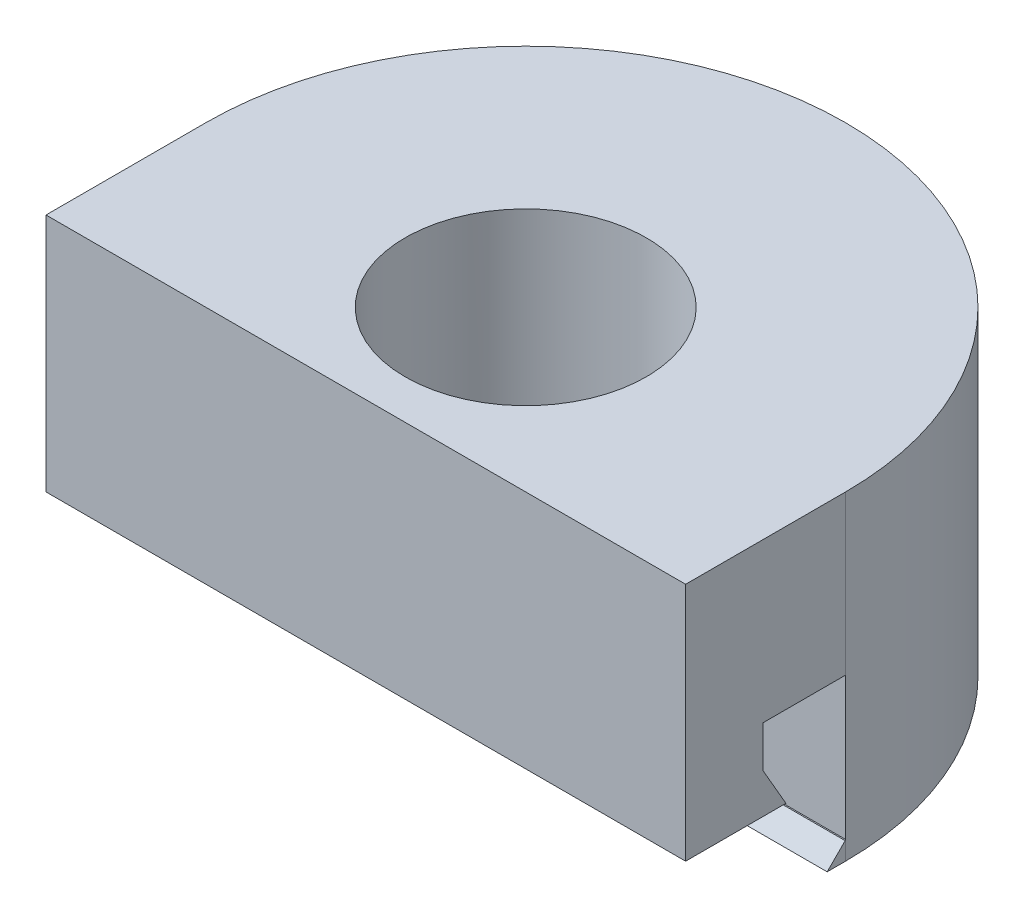
ISO-10303-21;
HEADER;
FILE_DESCRIPTION(('STEP AP214'),'2;1');
FILE_NAME('part.step','',(''),(''),'','','');
FILE_SCHEMA(('AUTOMOTIVE_DESIGN { 1 0 10303 214 1 1 1 1 }'));
ENDSEC;
DATA;
#1=APPLICATION_CONTEXT('core data for automotive mechanical design processes');
#2=APPLICATION_PROTOCOL_DEFINITION('international standard','automotive_design',2000,#1);
#3=PRODUCT_CONTEXT('',#1,'mechanical');
#4=PRODUCT('Part','Part','',(#3));
#5=PRODUCT_RELATED_PRODUCT_CATEGORY('part','',(#4));
#6=PRODUCT_DEFINITION_FORMATION('','',#4);
#7=PRODUCT_DEFINITION_CONTEXT('part definition',#1,'design');
#8=PRODUCT_DEFINITION('design','',#6,#7);
#9=PRODUCT_DEFINITION_SHAPE('','',#8);
#10=(LENGTH_UNIT() NAMED_UNIT(*) SI_UNIT(.MILLI.,.METRE.));
#11=(NAMED_UNIT(*) PLANE_ANGLE_UNIT() SI_UNIT($,.RADIAN.));
#12=(NAMED_UNIT(*) SI_UNIT($,.STERADIAN.) SOLID_ANGLE_UNIT());
#13=UNCERTAINTY_MEASURE_WITH_UNIT(LENGTH_MEASURE(1.E-05),#10,'distance_accuracy_value','');
#14=(GEOMETRIC_REPRESENTATION_CONTEXT(3) GLOBAL_UNCERTAINTY_ASSIGNED_CONTEXT((#13)) GLOBAL_UNIT_ASSIGNED_CONTEXT((#10,
#11,#12)) REPRESENTATION_CONTEXT('',''));
#15=CARTESIAN_POINT('',(0.,0.,0.));
#16=DIRECTION('',(0.,0.,1.));
#17=DIRECTION('',(1.,0.,0.));
#18=AXIS2_PLACEMENT_3D('',#15,#16,#17);
#19=CARTESIAN_POINT('',(0.,0.,0.));
#20=DIRECTION('',(0.,1.,0.));
#21=DIRECTION('',(0.,0.,1.));
#22=AXIS2_PLACEMENT_3D('',#19,#20,#21);
#23=PLANE('',#22);
#24=DIRECTION('',(1.,0.,0.));
#25=VECTOR('',#24,1.);
#26=CARTESIAN_POINT('',(0.,0.,2.9171512875255));
#27=LINE('',#26,#25);
#28=CARTESIAN_POINT('',(-50.8,0.,2.91715128752548));
#29=VERTEX_POINT('',#28);
#30=CARTESIAN_POINT('',(-18.9265086699552,0.,2.91715128752549));
#31=VERTEX_POINT('',#30);
#32=EDGE_CURVE('E239',#29,#31,#27,.T.);
#33=ORIENTED_EDGE('',*,*,#32,.F.);
#34=DIRECTION('',(0.,0.,-1.));
#35=VECTOR('',#34,1.);
#36=CARTESIAN_POINT('',(-50.8,0.,25.4));
#37=LINE('',#36,#35);
#38=CARTESIAN_POINT('',(-50.8,0.,0.));
#39=VERTEX_POINT('',#38);
#40=EDGE_CURVE('E51',#29,#39,#37,.T.);
#41=ORIENTED_EDGE('',*,*,#40,.T.);
#42=CARTESIAN_POINT('',(0.,0.,0.));
#43=DIRECTION('',(0.,1.,0.));
#44=DIRECTION('',(0.,0.,1.));
#45=AXIS2_PLACEMENT_3D('',#42,#43,#44);
#46=CIRCLE('',#45,50.8);
#47=CARTESIAN_POINT('',(50.8,0.,0.));
#48=VERTEX_POINT('',#47);
#49=EDGE_CURVE('E279',#48,#39,#46,.T.);
#50=ORIENTED_EDGE('',*,*,#49,.F.);
#51=DIRECTION('',(0.,0.,-1.));
#52=VECTOR('',#51,1.);
#53=CARTESIAN_POINT('',(50.8,0.,25.4));
#54=LINE('',#53,#52);
#55=CARTESIAN_POINT('',(50.8,0.,2.91715128752547));
#56=VERTEX_POINT('',#55);
#57=EDGE_CURVE('E60',#56,#48,#54,.T.);
#58=ORIENTED_EDGE('',*,*,#57,.F.);
#59=CARTESIAN_POINT('',(18.9265086699552,0.,2.9171512875255));
#60=VERTEX_POINT('',#59);
#61=EDGE_CURVE('E241',#60,#56,#27,.T.);
#62=ORIENTED_EDGE('',*,*,#61,.F.);
#63=CARTESIAN_POINT('',(0.,0.,0.));
#64=DIRECTION('',(0.,1.,0.));
#65=DIRECTION('',(0.,0.,1.));
#66=AXIS2_PLACEMENT_3D('',#63,#64,#65);
#67=CIRCLE('',#66,19.150000054);
#68=EDGE_CURVE('E254',#60,#31,#67,.T.);
#69=ORIENTED_EDGE('',*,*,#68,.T.);
#70=EDGE_LOOP('',(#33,#41,#50,#58,#62,#69));
#71=FACE_BOUND('',#70,.T.);
#72=ADVANCED_FACE('F35',(#71),#23,.F.);
#73=CARTESIAN_POINT('',(-50.8,50.8,25.4));
#74=DIRECTION('',(1.,0.,0.));
#75=DIRECTION('',(0.,0.,-1.));
#76=AXIS2_PLACEMENT_3D('',#73,#74,#75);
#77=PLANE('',#76);
#78=DIRECTION('',(0.,1.,0.));
#79=VECTOR('',#78,1.);
#80=CARTESIAN_POINT('',(-50.8,25.6,13.1000000000001));
#81=LINE('',#80,#79);
#82=CARTESIAN_POINT('',(-50.8,19.05,13.1000000000001));
#83=VERTEX_POINT('',#82);
#84=CARTESIAN_POINT('',(-50.8,25.6,13.1000000000001));
#85=VERTEX_POINT('',#84);
#86=EDGE_CURVE('E182',#83,#85,#81,.T.);
#87=ORIENTED_EDGE('',*,*,#86,.F.);
#88=CARTESIAN_POINT('',(-50.8,18.9500000000001,13.273205080757));
#89=DIRECTION('',(1.,0.,0.));
#90=DIRECTION('',(0.,0.,-1.));
#91=AXIS2_PLACEMENT_3D('',#88,#89,#90);
#92=CIRCLE('',#91,0.2);
#93=CARTESIAN_POINT('',(-50.8,18.9499999999999,13.073205080757));
#94=VERTEX_POINT('',#93);
#95=EDGE_CURVE('E176',#83,#94,#92,.F.);
#96=ORIENTED_EDGE('',*,*,#95,.T.);
#97=DIRECTION('',(0.,0.866025403784441,0.499999999999997));
#98=VECTOR('',#97,1.);
#99=CARTESIAN_POINT('',(-50.8,18.9499999999999,13.073205080757));
#100=LINE('',#99,#98);
#101=CARTESIAN_POINT('',(-50.8,12.7,9.46476589832194));
#102=VERTEX_POINT('',#101);
#103=EDGE_CURVE('E179',#102,#94,#100,.T.);
#104=ORIENTED_EDGE('',*,*,#103,.F.);
#105=DIRECTION('',(0.,0.,1.));
#106=VECTOR('',#105,1.);
#107=CARTESIAN_POINT('',(-50.8,12.7,25.4));
#108=LINE('',#107,#106);
#109=CARTESIAN_POINT('',(-50.8,12.7,25.4));
#110=VERTEX_POINT('',#109);
#111=EDGE_CURVE('E251',#102,#110,#108,.T.);
#112=ORIENTED_EDGE('',*,*,#111,.T.);
#113=DIRECTION('',(0.,-1.,0.));
#114=VECTOR('',#113,1.);
#115=CARTESIAN_POINT('',(-50.8,50.8,25.4));
#116=LINE('',#115,#114);
#117=CARTESIAN_POINT('',(-50.8,50.8,25.4));
#118=VERTEX_POINT('',#117);
#119=EDGE_CURVE('E262',#118,#110,#116,.T.);
#120=ORIENTED_EDGE('',*,*,#119,.F.);
#121=DIRECTION('',(0.,0.,-1.));
#122=VECTOR('',#121,1.);
#123=CARTESIAN_POINT('',(-50.8,50.8,25.4));
#124=LINE('',#123,#122);
#125=CARTESIAN_POINT('',(-50.8,50.8,0.));
#126=VERTEX_POINT('',#125);
#127=EDGE_CURVE('E272',#118,#126,#124,.T.);
#128=ORIENTED_EDGE('',*,*,#127,.T.);
#129=DIRECTION('',(0.,1.,0.));
#130=VECTOR('',#129,1.);
#131=CARTESIAN_POINT('',(-50.8,0.,0.));
#132=LINE('',#131,#130);
#133=CARTESIAN_POINT('',(-50.8,25.6,1.06765532852794E-13));
#134=VERTEX_POINT('',#133);
#135=EDGE_CURVE('E281',#134,#126,#132,.T.);
#136=ORIENTED_EDGE('',*,*,#135,.F.);
#137=DIRECTION('',(0.,0.,-1.));
#138=VECTOR('',#137,1.);
#139=CARTESIAN_POINT('',(-50.8,25.6,1.06765532852794E-13));
#140=LINE('',#139,#138);
#141=EDGE_CURVE('E221',#85,#134,#140,.T.);
#142=ORIENTED_EDGE('',*,*,#141,.F.);
#143=EDGE_LOOP('',(#87,#96,#104,#112,#120,#128,#136,#142));
#144=FACE_BOUND('',#143,.T.);
#145=ADVANCED_FACE('F178',(#144),#77,.F.);
#146=CARTESIAN_POINT('',(50.8,50.8,25.4));
#147=DIRECTION('',(-1.,0.,0.));
#148=DIRECTION('',(0.,0.,1.));
#149=AXIS2_PLACEMENT_3D('',#146,#147,#148);
#150=PLANE('',#149);
#151=DIRECTION('',(0.,-0.866025403784441,-0.499999999999997));
#152=VECTOR('',#151,1.);
#153=CARTESIAN_POINT('',(50.8,18.9499999999999,13.073205080757));
#154=LINE('',#153,#152);
#155=CARTESIAN_POINT('',(50.8,18.9499999999999,13.073205080757));
#156=VERTEX_POINT('',#155);
#157=CARTESIAN_POINT('',(50.8,12.7,9.46476589832195));
#158=VERTEX_POINT('',#157);
#159=EDGE_CURVE('E201',#156,#158,#154,.T.);
#160=ORIENTED_EDGE('',*,*,#159,.F.);
#161=CARTESIAN_POINT('',(50.8,18.9500000000001,13.2732050807571));
#162=DIRECTION('',(-1.,0.,0.));
#163=DIRECTION('',(0.,0.,1.));
#164=AXIS2_PLACEMENT_3D('',#161,#162,#163);
#165=CIRCLE('',#164,0.2);
#166=CARTESIAN_POINT('',(50.8,19.05,13.1000000000001));
#167=VERTEX_POINT('',#166);
#168=EDGE_CURVE('E188',#156,#167,#165,.F.);
#169=ORIENTED_EDGE('',*,*,#168,.T.);
#170=DIRECTION('',(0.,-1.,0.));
#171=VECTOR('',#170,1.);
#172=CARTESIAN_POINT('',(50.8000000000001,25.6,13.1000000000001));
#173=LINE('',#172,#171);
#174=CARTESIAN_POINT('',(50.8000000000001,25.6,13.1000000000001));
#175=VERTEX_POINT('',#174);
#176=EDGE_CURVE('E214',#175,#167,#173,.T.);
#177=ORIENTED_EDGE('',*,*,#176,.F.);
#178=DIRECTION('',(0.,0.,1.));
#179=VECTOR('',#178,1.);
#180=CARTESIAN_POINT('',(50.8,25.6,1.06765532852794E-13));
#181=LINE('',#180,#179);
#182=CARTESIAN_POINT('',(50.8,25.6,1.06765532852794E-13));
#183=VERTEX_POINT('',#182);
#184=EDGE_CURVE('E228',#183,#175,#181,.T.);
#185=ORIENTED_EDGE('',*,*,#184,.F.);
#186=DIRECTION('',(0.,1.,0.));
#187=VECTOR('',#186,1.);
#188=CARTESIAN_POINT('',(50.8,0.,0.));
#189=LINE('',#188,#187);
#190=CARTESIAN_POINT('',(50.8,50.8,0.));
#191=VERTEX_POINT('',#190);
#192=EDGE_CURVE('E275',#183,#191,#189,.T.);
#193=ORIENTED_EDGE('',*,*,#192,.T.);
#194=DIRECTION('',(0.,0.,-1.));
#195=VECTOR('',#194,1.);
#196=CARTESIAN_POINT('',(50.8,50.8,25.4));
#197=LINE('',#196,#195);
#198=CARTESIAN_POINT('',(50.8,50.8,25.4));
#199=VERTEX_POINT('',#198);
#200=EDGE_CURVE('E267',#199,#191,#197,.T.);
#201=ORIENTED_EDGE('',*,*,#200,.F.);
#202=DIRECTION('',(0.,1.,0.));
#203=VECTOR('',#202,1.);
#204=CARTESIAN_POINT('',(50.8,50.8,25.4));
#205=LINE('',#204,#203);
#206=CARTESIAN_POINT('',(50.8,12.7,25.4));
#207=VERTEX_POINT('',#206);
#208=EDGE_CURVE('E265',#207,#199,#205,.T.);
#209=ORIENTED_EDGE('',*,*,#208,.F.);
#210=DIRECTION('',(0.,0.,-1.));
#211=VECTOR('',#210,1.);
#212=CARTESIAN_POINT('',(50.8,12.7,25.4));
#213=LINE('',#212,#211);
#214=EDGE_CURVE('E248',#207,#158,#213,.T.);
#215=ORIENTED_EDGE('',*,*,#214,.T.);
#216=EDGE_LOOP('',(#160,#169,#177,#185,#193,#201,#209,#215));
#217=FACE_BOUND('',#216,.T.);
#218=ADVANCED_FACE('F370',(#217),#150,.F.);
#219=CARTESIAN_POINT('',(0.,50.8,0.));
#220=DIRECTION('',(0.,-1.,0.));
#221=DIRECTION('',(0.,0.,-1.));
#222=AXIS2_PLACEMENT_3D('',#219,#220,#221);
#223=CYLINDRICAL_SURFACE('',#222,50.8);
#224=CARTESIAN_POINT('',(0.,50.8,0.));
#225=DIRECTION('',(0.,1.,0.));
#226=DIRECTION('',(0.,0.,1.));
#227=AXIS2_PLACEMENT_3D('',#224,#225,#226);
#228=CIRCLE('',#227,50.8);
#229=EDGE_CURVE('E285',#191,#126,#228,.T.);
#230=ORIENTED_EDGE('',*,*,#229,.F.);
#231=ORIENTED_EDGE('',*,*,#192,.F.);
#232=CARTESIAN_POINT('',(50.8,2.99999400000001,1.0676680893551E-13));
#233=VERTEX_POINT('',#232);
#234=EDGE_CURVE('E284',#233,#183,#189,.T.);
#235=ORIENTED_EDGE('',*,*,#234,.F.);
#236=EDGE_CURVE('E282',#48,#233,#189,.T.);
#237=ORIENTED_EDGE('',*,*,#236,.F.);
#238=ORIENTED_EDGE('',*,*,#49,.T.);
#239=CARTESIAN_POINT('',(-50.8,2.99999400000001,1.0676680893551E-13));
#240=VERTEX_POINT('',#239);
#241=EDGE_CURVE('E276',#39,#240,#132,.T.);
#242=ORIENTED_EDGE('',*,*,#241,.T.);
#243=EDGE_CURVE('E280',#240,#134,#132,.T.);
#244=ORIENTED_EDGE('',*,*,#243,.T.);
#245=ORIENTED_EDGE('',*,*,#135,.T.);
#246=EDGE_LOOP('',(#230,#231,#235,#237,#238,#242,#244,#245));
#247=FACE_BOUND('',#246,.T.);
#248=ADVANCED_FACE('F376',(#247),#223,.T.);
#249=CARTESIAN_POINT('',(0.,50.8,0.));
#250=DIRECTION('',(0.,1.,0.));
#251=DIRECTION('',(0.,0.,1.));
#252=AXIS2_PLACEMENT_3D('',#249,#250,#251);
#253=PLANE('',#252);
#254=CARTESIAN_POINT('',(0.,50.8,0.));
#255=DIRECTION('',(0.,1.,0.));
#256=DIRECTION('',(0.,0.,1.));
#257=AXIS2_PLACEMENT_3D('',#254,#255,#256);
#258=CIRCLE('',#257,19.150000054);
#259=CARTESIAN_POINT('',(0.,50.8,19.150000054));
#260=VERTEX_POINT('',#259);
#261=EDGE_CURVE('E253',#260,#260,#258,.T.);
#262=ORIENTED_EDGE('',*,*,#261,.F.);
#263=EDGE_LOOP('',(#262));
#264=FACE_BOUND('',#263,.T.);
#265=ORIENTED_EDGE('',*,*,#229,.T.);
#266=ORIENTED_EDGE('',*,*,#127,.F.);
#267=DIRECTION('',(-1.,0.,0.));
#268=VECTOR('',#267,1.);
#269=CARTESIAN_POINT('',(-50.8,50.8,25.4));
#270=LINE('',#269,#268);
#271=EDGE_CURVE('E257',#199,#118,#270,.T.);
#272=ORIENTED_EDGE('',*,*,#271,.F.);
#273=ORIENTED_EDGE('',*,*,#200,.T.);
#274=EDGE_LOOP('',(#265,#266,#272,#273));
#275=FACE_BOUND('',#274,.T.);
#276=ADVANCED_FACE('F375',(#264,#275),#253,.T.);
#277=DIRECTION('',(0.,-0.707106781186548,0.707106781186547));
#278=VECTOR('',#277,1.);
#279=CARTESIAN_POINT('',(-50.8,2.8585726437627,0.058578643762791));
#280=LINE('',#279,#278);
#281=CARTESIAN_POINT('',(-50.8,2.8585726437627,0.058578643762791));
#282=VERTEX_POINT('',#281);
#283=EDGE_CURVE('E230',#282,#29,#280,.T.);
#284=ORIENTED_EDGE('',*,*,#283,.F.);
#285=CARTESIAN_POINT('',(-50.8,2.8585726437627,-0.141421356237209));
#286=DIRECTION('',(1.,0.,0.));
#287=DIRECTION('',(0.,0.,-1.));
#288=AXIS2_PLACEMENT_3D('',#285,#286,#287);
#289=CIRCLE('',#288,0.2);
#290=EDGE_CURVE('E11',#282,#240,#289,.F.);
#291=ORIENTED_EDGE('',*,*,#290,.T.);
#292=ORIENTED_EDGE('',*,*,#241,.F.);
#293=ORIENTED_EDGE('',*,*,#40,.F.);
#294=EDGE_LOOP('',(#284,#291,#292,#293));
#295=FACE_BOUND('',#294,.T.);
#296=ADVANCED_FACE('F372',(#295),#77,.F.);
#297=ORIENTED_EDGE('',*,*,#236,.T.);
#298=CARTESIAN_POINT('',(50.8,2.85857264376271,-0.141421356237203));
#299=DIRECTION('',(-1.,0.,0.));
#300=DIRECTION('',(0.,0.,1.));
#301=AXIS2_PLACEMENT_3D('',#298,#299,#300);
#302=CIRCLE('',#301,0.2);
#303=CARTESIAN_POINT('',(50.8,2.8585726437627,0.0585786437627975));
#304=VERTEX_POINT('',#303);
#305=EDGE_CURVE('E44',#233,#304,#302,.F.);
#306=ORIENTED_EDGE('',*,*,#305,.T.);
#307=DIRECTION('',(0.,0.707106781186548,-0.707106781186547));
#308=VECTOR('',#307,1.);
#309=CARTESIAN_POINT('',(50.8,2.8585726437627,0.0585786437627975));
#310=LINE('',#309,#308);
#311=EDGE_CURVE('E232',#56,#304,#310,.T.);
#312=ORIENTED_EDGE('',*,*,#311,.F.);
#313=ORIENTED_EDGE('',*,*,#57,.T.);
#314=EDGE_LOOP('',(#297,#306,#312,#313));
#315=FACE_BOUND('',#314,.T.);
#316=ADVANCED_FACE('F432',(#315),#150,.F.);
#317=CARTESIAN_POINT('',(0.,0.,25.4));
#318=DIRECTION('',(0.,0.,-1.));
#319=DIRECTION('',(-1.,0.,0.));
#320=AXIS2_PLACEMENT_3D('',#317,#318,#319);
#321=PLANE('',#320);
#322=ORIENTED_EDGE('',*,*,#119,.T.);
#323=DIRECTION('',(1.,0.,0.));
#324=VECTOR('',#323,1.);
#325=CARTESIAN_POINT('',(0.,12.7,25.4));
#326=LINE('',#325,#324);
#327=EDGE_CURVE('E244',#110,#207,#326,.T.);
#328=ORIENTED_EDGE('',*,*,#327,.T.);
#329=ORIENTED_EDGE('',*,*,#208,.T.);
#330=ORIENTED_EDGE('',*,*,#271,.T.);
#331=EDGE_LOOP('',(#322,#328,#329,#330));
#332=FACE_BOUND('',#331,.T.);
#333=ADVANCED_FACE('F334',(#332),#321,.F.);
#334=CARTESIAN_POINT('',(0.,0.,0.));
#335=DIRECTION('',(0.,1.,0.));
#336=DIRECTION('',(0.,0.,1.));
#337=AXIS2_PLACEMENT_3D('',#334,#335,#336);
#338=CYLINDRICAL_SURFACE('',#337,19.150000054);
#339=CARTESIAN_POINT('',(0.,2.91715128752551,0.));
#340=DIRECTION('',(0.,0.707106781186547,0.707106781186548));
#341=DIRECTION('',(0.,0.707106781186548,-0.707106781186547));
#342=AXIS2_PLACEMENT_3D('',#339,#340,#341);
#343=ELLIPSE('',#342,27.0821897958123,19.150000054);
#344=CARTESIAN_POINT('',(19.1499104595999,2.8585726437627,0.0585786437627954));
#345=VERTEX_POINT('',#344);
#346=EDGE_CURVE('E300',#345,#60,#343,.F.);
#347=ORIENTED_EDGE('',*,*,#346,.F.);
#348=CARTESIAN_POINT('',(19.1499104595999,2.8585726437627,0.0585786437627954));
#349=CARTESIAN_POINT('',(19.149910148116,2.86981581915862,0.0585884535927359));
#350=CARTESIAN_POINT('',(19.1499133530788,2.88105630964286,0.0576312712027324));
#351=CARTESIAN_POINT('',(19.1499245049972,2.90322765226102,0.0538512589163121));
#352=CARTESIAN_POINT('',(19.1499324552599,2.91415828287546,0.0510271277484018));
#353=CARTESIAN_POINT('',(19.1499508071202,2.93539626771108,0.0435792127702025));
#354=CARTESIAN_POINT('',(19.149961210375,2.94570319467062,0.03895421106282));
#355=CARTESIAN_POINT('',(19.1499802933433,2.96537406225475,0.0280464602271899));
#356=CARTESIAN_POINT('',(19.1499889765482,2.97473989366717,0.0217671307433029));
#357=CARTESIAN_POINT('',(19.1499979164099,2.9892749555163,0.0101435267006782));
#358=CARTESIAN_POINT('',(19.1500000414497,2.99478205719738,0.00521680397962861));
#359=CARTESIAN_POINT('',(19.150000054,2.99999400000001,1.12050224132078E-13));
#360=B_SPLINE_CURVE_WITH_KNOTS('',3,(#348,#349,#350,#351,#352,#353,#354,#355,#356,#357,#358,
#359),.UNSPECIFIED.,.F.,.F.,(4,2,2,2,2,4),(0.,0.033685128740897,0.0673937609543259,
0.101125229428158,0.134787511665385,0.156908434905279),.UNSPECIFIED.);
#361=CARTESIAN_POINT('',(19.150000054,2.99999400000001,1.0676680893551E-13));
#362=VERTEX_POINT('',#361);
#363=EDGE_CURVE('E347',#345,#362,#360,.T.);
#364=ORIENTED_EDGE('',*,*,#363,.T.);
#365=DIRECTION('',(0.,1.,0.));
#366=VECTOR('',#365,1.);
#367=CARTESIAN_POINT('',(19.150000054,0.,1.0676680893551E-13));
#368=LINE('',#367,#366);
#369=CARTESIAN_POINT('',(19.150000054,25.6,1.06765532852794E-13));
#370=VERTEX_POINT('',#369);
#371=EDGE_CURVE('E292',#362,#370,#368,.T.);
#372=ORIENTED_EDGE('',*,*,#371,.T.);
#373=CARTESIAN_POINT('',(0.,25.6,0.));
#374=DIRECTION('',(0.,1.,0.));
#375=DIRECTION('',(0.,0.,1.));
#376=AXIS2_PLACEMENT_3D('',#373,#374,#375);
#377=CIRCLE('',#376,19.150000054);
#378=CARTESIAN_POINT('',(13.9682676831523,25.6,13.1000000000001));
#379=VERTEX_POINT('',#378);
#380=EDGE_CURVE('E301',#370,#379,#377,.F.);
#381=ORIENTED_EDGE('',*,*,#380,.T.);
#382=DIRECTION('',(0.,1.,0.));
#383=VECTOR('',#382,1.);
#384=CARTESIAN_POINT('',(13.9682676831523,0.,13.1000000000001));
#385=LINE('',#384,#383);
#386=CARTESIAN_POINT('',(13.9682676831523,19.05,13.1000000000001));
#387=VERTEX_POINT('',#386);
#388=EDGE_CURVE('E307',#379,#387,#385,.F.);
#389=ORIENTED_EDGE('',*,*,#388,.T.);
#390=CARTESIAN_POINT('',(13.9682676831523,19.05,13.1000000000001));
#391=CARTESIAN_POINT('',(13.9721993721743,19.0427513446824,13.0958077378837));
#392=CARTESIAN_POINT('',(13.9757794343796,19.0350666030045,13.0919865781498));
#393=CARTESIAN_POINT('',(13.9819770944442,19.0191980214519,13.0853673403173));
#394=CARTESIAN_POINT('',(13.9846187969349,19.0110341353284,13.0825436516487));
#395=CARTESIAN_POINT('',(13.9888771362047,18.9943202704052,13.0779902406273));
#396=CARTESIAN_POINT('',(13.9905124715901,18.9857807074416,13.0762405644553));
#397=CARTESIAN_POINT('',(13.9927698615633,18.9681724205395,13.0738247899));
#398=CARTESIAN_POINT('',(13.9933620895332,18.9590955673604,13.0731905880793));
#399=CARTESIAN_POINT('',(13.9933488123704,18.9499999999999,13.073205080757));
#400=B_SPLINE_CURVE_WITH_KNOTS('',3,(#390,#391,#392,#393,#394,#395,#396,#397,#398,#399),
.UNSPECIFIED.,.F.,.F.,(4,2,2,2,4),(0.,0.0277647469352173,0.0547534507439041,0.0812242291059608,
0.108440324802649),.UNSPECIFIED.);
#401=CARTESIAN_POINT('',(13.9933488123704,18.9499999999999,13.073205080757));
#402=VERTEX_POINT('',#401);
#403=EDGE_CURVE('E320',#387,#402,#400,.T.);
#404=ORIENTED_EDGE('',*,*,#403,.T.);
#405=CARTESIAN_POINT('',(0.,-3.69345541763907,0.));
#406=DIRECTION('',(0.,-0.499999999999997,0.866025403784441));
#407=DIRECTION('',(0.,0.866025403784441,0.499999999999997));
#408=AXIS2_PLACEMENT_3D('',#405,#406,#407);
#409=ELLIPSE('',#408,38.3000001080003,19.150000054);
#410=CARTESIAN_POINT('',(16.64754361935,12.7,9.46476589832195));
#411=VERTEX_POINT('',#410);
#412=EDGE_CURVE('E203',#402,#411,#409,.F.);
#413=ORIENTED_EDGE('',*,*,#412,.T.);
#414=CARTESIAN_POINT('',(0.,12.7,0.));
#415=DIRECTION('',(0.,1.,0.));
#416=DIRECTION('',(0.,0.,1.));
#417=AXIS2_PLACEMENT_3D('',#414,#415,#416);
#418=CIRCLE('',#417,19.150000054);
#419=CARTESIAN_POINT('',(-16.64754361935,12.7,9.46476589832194));
#420=VERTEX_POINT('',#419);
#421=EDGE_CURVE('E288',#411,#420,#418,.F.);
#422=ORIENTED_EDGE('',*,*,#421,.T.);
#423=CARTESIAN_POINT('',(-13.9933488123704,18.9499999999999,13.073205080757));
#424=VERTEX_POINT('',#423);
#425=EDGE_CURVE('E208',#420,#424,#409,.F.);
#426=ORIENTED_EDGE('',*,*,#425,.T.);
#427=CARTESIAN_POINT('',(-13.9933488123704,18.9499999999999,13.073205080757));
#428=CARTESIAN_POINT('',(-13.993362897217,18.9592309549283,13.0731897084725));
#429=CARTESIAN_POINT('',(-13.9927525617433,18.9684420100515,13.0738433084745));
#430=CARTESIAN_POINT('',(-13.9904288209403,18.9862989279281,13.0763300728142));
#431=CARTESIAN_POINT('',(-13.9887464749039,18.9949533806866,13.0781300232705));
#432=CARTESIAN_POINT('',(-13.9844318722341,19.0116368032075,13.0827434607284));
#433=CARTESIAN_POINT('',(-13.981808420046,19.0196707581813,13.0855475531448));
#434=CARTESIAN_POINT('',(-13.9756749718016,19.0352898703709,13.0920980761578));
#435=CARTESIAN_POINT('',(-13.9721419863532,19.042855890708,13.0958689305325));
#436=CARTESIAN_POINT('',(-13.9682676831529,19.0500000000003,13.0999999999995));
#437=B_SPLINE_CURVE_WITH_KNOTS('',3,(#427,#428,#429,#430,#431,#432,#433,#434,#435,#436),
.UNSPECIFIED.,.F.,.F.,(4,2,2,2,4),(0.,0.0276185774952255,0.0544712469811532,0.0810789836287736,
0.108439765985715),.UNSPECIFIED.);
#438=CARTESIAN_POINT('',(-13.9682676831523,19.05,13.1000000000001));
#439=VERTEX_POINT('',#438);
#440=EDGE_CURVE('E200',#424,#439,#437,.T.);
#441=ORIENTED_EDGE('',*,*,#440,.T.);
#442=DIRECTION('',(0.,1.,0.));
#443=VECTOR('',#442,1.);
#444=CARTESIAN_POINT('',(-13.9682676831523,0.,13.1000000000001));
#445=LINE('',#444,#443);
#446=CARTESIAN_POINT('',(-13.9682676831523,25.6,13.1000000000001));
#447=VERTEX_POINT('',#446);
#448=EDGE_CURVE('E304',#439,#447,#445,.T.);
#449=ORIENTED_EDGE('',*,*,#448,.T.);
#450=CARTESIAN_POINT('',(-19.150000054,25.6,1.06765532852794E-13));
#451=VERTEX_POINT('',#450);
#452=EDGE_CURVE('E303',#447,#451,#377,.F.);
#453=ORIENTED_EDGE('',*,*,#452,.T.);
#454=DIRECTION('',(0.,1.,0.));
#455=VECTOR('',#454,1.);
#456=CARTESIAN_POINT('',(-19.150000054,0.,1.0676680893551E-13));
#457=LINE('',#456,#455);
#458=CARTESIAN_POINT('',(-19.150000054,2.99999400000001,1.0676680893551E-13));
#459=VERTEX_POINT('',#458);
#460=EDGE_CURVE('E294',#451,#459,#457,.F.);
#461=ORIENTED_EDGE('',*,*,#460,.T.);
#462=CARTESIAN_POINT('',(-19.150000054,2.99999400000001,1.0676680893551E-13));
#463=CARTESIAN_POINT('',(-19.149999978416,2.99205081106789,0.00795706163376005));
#464=CARTESIAN_POINT('',(-19.1499950786679,2.98342575555599,0.0152284573751245));
#465=CARTESIAN_POINT('',(-19.1499803702841,2.96507538004702,0.0282330901653697));
#466=CARTESIAN_POINT('',(-19.1499705582254,2.95534929646245,0.033965250314199));
#467=CARTESIAN_POINT('',(-19.149950771315,2.93506530476494,0.043716301968787));
#468=CARTESIAN_POINT('',(-19.1499407963577,2.92450683764964,0.0477340303024708));
#469=CARTESIAN_POINT('',(-19.1499243809788,2.90288448992475,0.0539304906695428));
#470=CARTESIAN_POINT('',(-19.1499179333496,2.89182169038457,0.0561129777530073));
#471=CARTESIAN_POINT('',(-19.1499116847776,2.87332471660678,0.0581716908864029));
#472=CARTESIAN_POINT('',(-19.1499103628968,2.86594688466509,0.0585820812218218));
#473=CARTESIAN_POINT('',(-19.1499104595999,2.8585726437627,0.0585786437627929));
#474=B_SPLINE_CURVE_WITH_KNOTS('',3,(#462,#463,#464,#465,#466,#467,#468,#469,#470,#471,#472,
#473),.UNSPECIFIED.,.F.,.F.,(4,2,2,2,2,4),(0.,0.0336851252190556,0.0673937566210509,
0.101125221732399,0.134787500468994,0.156908434788356),.UNSPECIFIED.);
#475=CARTESIAN_POINT('',(-19.1499104595999,2.8585726437627,0.058578643762793));
#476=VERTEX_POINT('',#475);
#477=EDGE_CURVE('E187',#459,#476,#474,.T.);
#478=ORIENTED_EDGE('',*,*,#477,.T.);
#479=EDGE_CURVE('E297',#31,#476,#343,.F.);
#480=ORIENTED_EDGE('',*,*,#479,.F.);
#481=ORIENTED_EDGE('',*,*,#68,.F.);
#482=EDGE_LOOP('',(#347,#364,#372,#381,#389,#404,#413,#422,#426,#441,#449,#453,#461,#478,#480,#481));
#483=FACE_BOUND('',#482,.T.);
#484=ORIENTED_EDGE('',*,*,#261,.T.);
#485=EDGE_LOOP('',(#484));
#486=FACE_BOUND('',#485,.T.);
#487=ADVANCED_FACE('F328',(#483,#486),#338,.F.);
#488=CARTESIAN_POINT('',(-73.2829577861505,12.7,25.6000000000001));
#489=DIRECTION('',(0.,1.,0.));
#490=DIRECTION('',(0.,0.,-1.));
#491=AXIS2_PLACEMENT_3D('',#488,#489,#490);
#492=PLANE('',#491);
#493=ORIENTED_EDGE('',*,*,#111,.F.);
#494=DIRECTION('',(1.,0.,0.));
#495=VECTOR('',#494,1.);
#496=CARTESIAN_POINT('',(-73.2829577861505,12.7,9.46476589832193));
#497=LINE('',#496,#495);
#498=EDGE_CURVE('E195',#102,#420,#497,.T.);
#499=ORIENTED_EDGE('',*,*,#498,.T.);
#500=ORIENTED_EDGE('',*,*,#421,.F.);
#501=EDGE_CURVE('E310',#411,#158,#497,.T.);
#502=ORIENTED_EDGE('',*,*,#501,.T.);
#503=ORIENTED_EDGE('',*,*,#214,.F.);
#504=ORIENTED_EDGE('',*,*,#327,.F.);
#505=EDGE_LOOP('',(#493,#499,#500,#502,#503,#504));
#506=FACE_BOUND('',#505,.T.);
#507=ADVANCED_FACE('F333',(#506),#492,.F.);
#508=CARTESIAN_POINT('',(0.,0.,1.0676680893551E-13));
#509=DIRECTION('',(0.,0.,-1.));
#510=DIRECTION('',(-1.,0.,0.));
#511=AXIS2_PLACEMENT_3D('',#508,#509,#510);
#512=PLANE('',#511);
#513=DIRECTION('',(1.,0.,0.));
#514=VECTOR('',#513,1.);
#515=CARTESIAN_POINT('',(-50.8,2.99999400000001,1.0676680893551E-13));
#516=LINE('',#515,#514);
#517=EDGE_CURVE('E245',#362,#233,#516,.T.);
#518=ORIENTED_EDGE('',*,*,#517,.T.);
#519=ORIENTED_EDGE('',*,*,#234,.T.);
#520=DIRECTION('',(1.,0.,0.));
#521=VECTOR('',#520,1.);
#522=CARTESIAN_POINT('',(-50.8,25.6,1.06765532852794E-13));
#523=LINE('',#522,#521);
#524=EDGE_CURVE('E224',#370,#183,#523,.T.);
#525=ORIENTED_EDGE('',*,*,#524,.F.);
#526=ORIENTED_EDGE('',*,*,#371,.F.);
#527=EDGE_LOOP('',(#518,#519,#525,#526));
#528=FACE_BOUND('',#527,.T.);
#529=ADVANCED_FACE('F474',(#528),#512,.F.);
#530=ORIENTED_EDGE('',*,*,#460,.F.);
#531=EDGE_CURVE('E225',#134,#451,#523,.T.);
#532=ORIENTED_EDGE('',*,*,#531,.F.);
#533=ORIENTED_EDGE('',*,*,#243,.F.);
#534=EDGE_CURVE('E242',#240,#459,#516,.T.);
#535=ORIENTED_EDGE('',*,*,#534,.T.);
#536=EDGE_LOOP('',(#530,#532,#533,#535));
#537=FACE_BOUND('',#536,.T.);
#538=ADVANCED_FACE('F415',(#537),#512,.F.);
#539=CARTESIAN_POINT('',(0.,1.45857564376275,1.45857564376275));
#540=DIRECTION('',(0.,0.707106781186547,0.707106781186548));
#541=DIRECTION('',(0.,-0.707106781186548,0.707106781186547));
#542=AXIS2_PLACEMENT_3D('',#539,#540,#541);
#543=PLANE('',#542);
#544=ORIENTED_EDGE('',*,*,#32,.T.);
#545=ORIENTED_EDGE('',*,*,#479,.T.);
#546=DIRECTION('',(-1.,0.,0.));
#547=VECTOR('',#546,1.);
#548=CARTESIAN_POINT('',(-50.8,2.8585726437627,0.058578643762791));
#549=LINE('',#548,#547);
#550=EDGE_CURVE('E235',#476,#282,#549,.T.);
#551=ORIENTED_EDGE('',*,*,#550,.T.);
#552=ORIENTED_EDGE('',*,*,#283,.T.);
#553=EDGE_LOOP('',(#544,#545,#551,#552));
#554=FACE_BOUND('',#553,.T.);
#555=ADVANCED_FACE('F429',(#554),#543,.T.);
#556=ORIENTED_EDGE('',*,*,#61,.T.);
#557=ORIENTED_EDGE('',*,*,#311,.T.);
#558=EDGE_CURVE('E236',#304,#345,#549,.T.);
#559=ORIENTED_EDGE('',*,*,#558,.T.);
#560=ORIENTED_EDGE('',*,*,#346,.T.);
#561=EDGE_LOOP('',(#556,#557,#559,#560));
#562=FACE_BOUND('',#561,.T.);
#563=ADVANCED_FACE('F510',(#562),#543,.T.);
#564=CARTESIAN_POINT('',(0.,25.6,0.));
#565=DIRECTION('',(0.,1.,0.));
#566=DIRECTION('',(0.,0.,1.));
#567=AXIS2_PLACEMENT_3D('',#564,#565,#566);
#568=PLANE('',#567);
#569=ORIENTED_EDGE('',*,*,#452,.F.);
#570=DIRECTION('',(1.,0.,0.));
#571=VECTOR('',#570,1.);
#572=CARTESIAN_POINT('',(-50.8,25.6,13.1000000000001));
#573=LINE('',#572,#571);
#574=EDGE_CURVE('E211',#85,#447,#573,.T.);
#575=ORIENTED_EDGE('',*,*,#574,.F.);
#576=ORIENTED_EDGE('',*,*,#141,.T.);
#577=ORIENTED_EDGE('',*,*,#531,.T.);
#578=EDGE_LOOP('',(#569,#575,#576,#577));
#579=FACE_BOUND('',#578,.T.);
#580=ADVANCED_FACE('F419',(#579),#568,.F.);
#581=ORIENTED_EDGE('',*,*,#524,.T.);
#582=ORIENTED_EDGE('',*,*,#184,.T.);
#583=EDGE_CURVE('E210',#379,#175,#573,.T.);
#584=ORIENTED_EDGE('',*,*,#583,.F.);
#585=ORIENTED_EDGE('',*,*,#380,.F.);
#586=EDGE_LOOP('',(#581,#582,#584,#585));
#587=FACE_BOUND('',#586,.T.);
#588=ADVANCED_FACE('F521',(#587),#568,.F.);
#589=CARTESIAN_POINT('',(0.,0.,13.1000000000001));
#590=DIRECTION('',(0.,0.,1.));
#591=DIRECTION('',(1.,0.,0.));
#592=AXIS2_PLACEMENT_3D('',#589,#590,#591);
#593=PLANE('',#592);
#594=ORIENTED_EDGE('',*,*,#583,.T.);
#595=ORIENTED_EDGE('',*,*,#176,.T.);
#596=DIRECTION('',(-1.,0.,0.));
#597=VECTOR('',#596,1.);
#598=CARTESIAN_POINT('',(-50.8,19.05,13.1000000000001));
#599=LINE('',#598,#597);
#600=EDGE_CURVE('E218',#167,#387,#599,.T.);
#601=ORIENTED_EDGE('',*,*,#600,.T.);
#602=ORIENTED_EDGE('',*,*,#388,.F.);
#603=EDGE_LOOP('',(#594,#595,#601,#602));
#604=FACE_BOUND('',#603,.T.);
#605=ADVANCED_FACE('F528',(#604),#593,.F.);
#606=EDGE_CURVE('E217',#439,#83,#599,.T.);
#607=ORIENTED_EDGE('',*,*,#606,.T.);
#608=ORIENTED_EDGE('',*,*,#86,.T.);
#609=ORIENTED_EDGE('',*,*,#574,.T.);
#610=ORIENTED_EDGE('',*,*,#448,.F.);
#611=EDGE_LOOP('',(#607,#608,#609,#610));
#612=FACE_BOUND('',#611,.T.);
#613=ADVANCED_FACE('F422',(#612),#593,.F.);
#614=CARTESIAN_POINT('',(0.,-0.923363854409748,1.59931310971033));
#615=DIRECTION('',(0.,-0.499999999999997,0.866025403784441));
#616=DIRECTION('',(0.,-0.866025403784441,-0.499999999999997));
#617=AXIS2_PLACEMENT_3D('',#614,#615,#616);
#618=PLANE('',#617);
#619=ORIENTED_EDGE('',*,*,#498,.F.);
#620=ORIENTED_EDGE('',*,*,#103,.T.);
#621=DIRECTION('',(1.,0.,0.));
#622=VECTOR('',#621,1.);
#623=CARTESIAN_POINT('',(-50.8,18.9499999999999,13.073205080757));
#624=LINE('',#623,#622);
#625=EDGE_CURVE('E192',#94,#424,#624,.T.);
#626=ORIENTED_EDGE('',*,*,#625,.T.);
#627=ORIENTED_EDGE('',*,*,#425,.F.);
#628=EDGE_LOOP('',(#619,#620,#626,#627));
#629=FACE_BOUND('',#628,.T.);
#630=ADVANCED_FACE('F191',(#629),#618,.F.);
#631=EDGE_CURVE('E196',#402,#156,#624,.T.);
#632=ORIENTED_EDGE('',*,*,#631,.T.);
#633=ORIENTED_EDGE('',*,*,#159,.T.);
#634=ORIENTED_EDGE('',*,*,#501,.F.);
#635=ORIENTED_EDGE('',*,*,#412,.F.);
#636=EDGE_LOOP('',(#632,#633,#634,#635));
#637=FACE_BOUND('',#636,.T.);
#638=ADVANCED_FACE('F381',(#637),#618,.F.);
#639=CARTESIAN_POINT('',(-50.8,18.9500000000001,13.273205080757));
#640=DIRECTION('',(-1.,0.,0.));
#641=DIRECTION('',(0.,0.,1.));
#642=AXIS2_PLACEMENT_3D('',#639,#640,#641);
#643=CYLINDRICAL_SURFACE('',#642,0.2);
#644=ORIENTED_EDGE('',*,*,#168,.F.);
#645=ORIENTED_EDGE('',*,*,#631,.F.);
#646=ORIENTED_EDGE('',*,*,#403,.F.);
#647=ORIENTED_EDGE('',*,*,#600,.F.);
#648=EDGE_LOOP('',(#644,#645,#646,#647));
#649=FACE_BOUND('',#648,.T.);
#650=ADVANCED_FACE('F361',(#649),#643,.T.);
#651=CARTESIAN_POINT('',(-50.8,18.9500000000001,13.273205080757));
#652=DIRECTION('',(-1.,0.,0.));
#653=DIRECTION('',(0.,0.,1.));
#654=AXIS2_PLACEMENT_3D('',#651,#652,#653);
#655=CYLINDRICAL_SURFACE('',#654,0.2);
#656=ORIENTED_EDGE('',*,*,#440,.F.);
#657=ORIENTED_EDGE('',*,*,#625,.F.);
#658=ORIENTED_EDGE('',*,*,#95,.F.);
#659=ORIENTED_EDGE('',*,*,#606,.F.);
#660=EDGE_LOOP('',(#656,#657,#658,#659));
#661=FACE_BOUND('',#660,.T.);
#662=ADVANCED_FACE('F199',(#661),#655,.T.);
#663=CARTESIAN_POINT('',(-50.8,2.8585726437627,-0.141421356237209));
#664=DIRECTION('',(-1.,0.,0.));
#665=DIRECTION('',(0.,-1.,0.));
#666=AXIS2_PLACEMENT_3D('',#663,#664,#665);
#667=CYLINDRICAL_SURFACE('',#666,0.2);
#668=ORIENTED_EDGE('',*,*,#305,.F.);
#669=ORIENTED_EDGE('',*,*,#517,.F.);
#670=ORIENTED_EDGE('',*,*,#363,.F.);
#671=ORIENTED_EDGE('',*,*,#558,.F.);
#672=EDGE_LOOP('',(#668,#669,#670,#671));
#673=FACE_BOUND('',#672,.T.);
#674=ADVANCED_FACE('F352',(#673),#667,.T.);
#675=CARTESIAN_POINT('',(-50.8,2.8585726437627,-0.141421356237209));
#676=DIRECTION('',(-1.,0.,0.));
#677=DIRECTION('',(0.,-1.,0.));
#678=AXIS2_PLACEMENT_3D('',#675,#676,#677);
#679=CYLINDRICAL_SURFACE('',#678,0.2);
#680=ORIENTED_EDGE('',*,*,#477,.F.);
#681=ORIENTED_EDGE('',*,*,#534,.F.);
#682=ORIENTED_EDGE('',*,*,#290,.F.);
#683=ORIENTED_EDGE('',*,*,#550,.F.);
#684=EDGE_LOOP('',(#680,#681,#682,#683));
#685=FACE_BOUND('',#684,.T.);
#686=ADVANCED_FACE('F37',(#685),#679,.T.);
#687=CLOSED_SHELL('',(#72,#145,#218,#248,#276,#296,#316,#333,#487,#507,#529,#538,#555,#563,#580,
#588,#605,#613,#630,#638,#650,#662,#674,#686));
#688=MANIFOLD_SOLID_BREP('B2',#687);
#689=ADVANCED_BREP_SHAPE_REPRESENTATION('',(#18,#688),#14);
#690=SHAPE_DEFINITION_REPRESENTATION(#9,#689);
ENDSEC;
END-ISO-10303-21;
